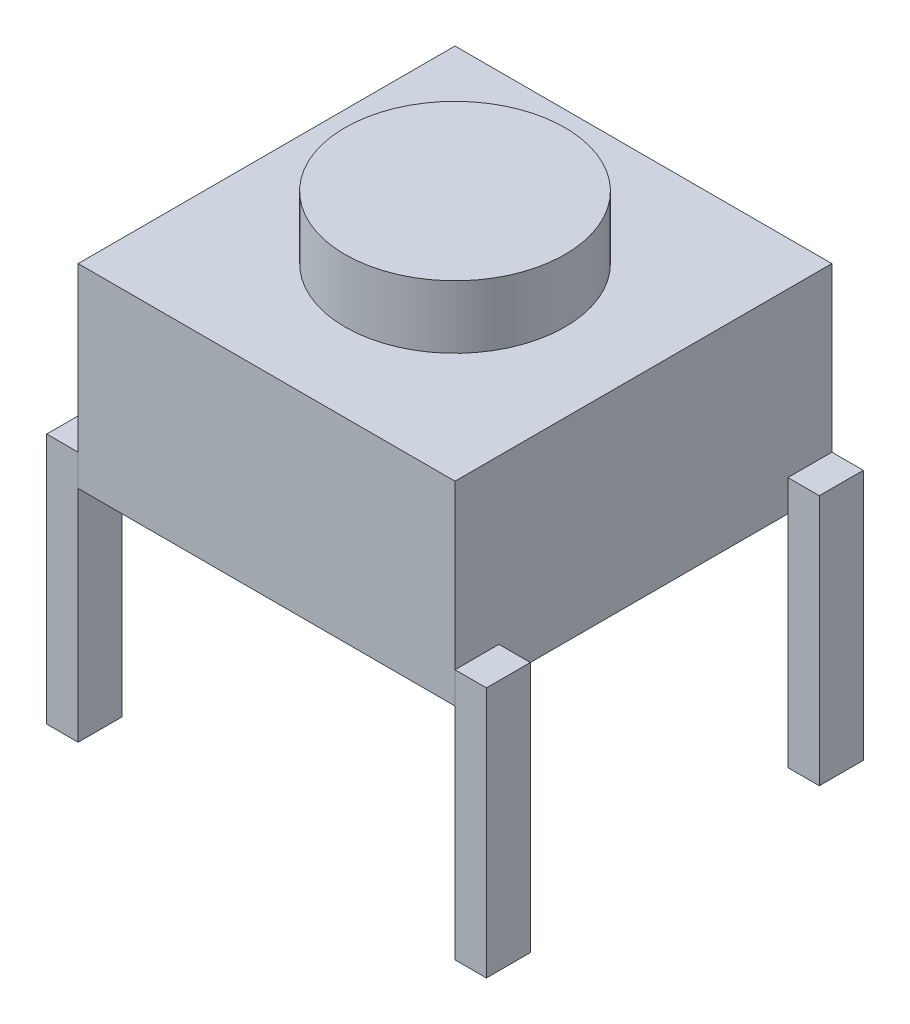
ISO-10303-21;
HEADER;
FILE_DESCRIPTION(('STEP AP214'),'2;1');
FILE_NAME('part.step','',(''),(''),'','','');
FILE_SCHEMA(('AUTOMOTIVE_DESIGN { 1 0 10303 214 1 1 1 1 }'));
ENDSEC;
DATA;
#1=APPLICATION_CONTEXT('core data for automotive mechanical design processes');
#2=APPLICATION_PROTOCOL_DEFINITION('international standard','automotive_design',2000,#1);
#3=PRODUCT_CONTEXT('',#1,'mechanical');
#4=PRODUCT('Part','Part','',(#3));
#5=PRODUCT_RELATED_PRODUCT_CATEGORY('part','',(#4));
#6=PRODUCT_DEFINITION_FORMATION('','',#4);
#7=PRODUCT_DEFINITION_CONTEXT('part definition',#1,'design');
#8=PRODUCT_DEFINITION('design','',#6,#7);
#9=PRODUCT_DEFINITION_SHAPE('','',#8);
#10=(LENGTH_UNIT() NAMED_UNIT(*) SI_UNIT(.MILLI.,.METRE.));
#11=(NAMED_UNIT(*) PLANE_ANGLE_UNIT() SI_UNIT($,.RADIAN.));
#12=(NAMED_UNIT(*) SI_UNIT($,.STERADIAN.) SOLID_ANGLE_UNIT());
#13=UNCERTAINTY_MEASURE_WITH_UNIT(LENGTH_MEASURE(1.E-05),#10,'distance_accuracy_value','');
#14=(GEOMETRIC_REPRESENTATION_CONTEXT(3) GLOBAL_UNCERTAINTY_ASSIGNED_CONTEXT((#13)) GLOBAL_UNIT_ASSIGNED_CONTEXT((#10,
#11,#12)) REPRESENTATION_CONTEXT('',''));
#15=CARTESIAN_POINT('',(0.,0.,0.));
#16=DIRECTION('',(0.,0.,1.));
#17=DIRECTION('',(1.,0.,0.));
#18=AXIS2_PLACEMENT_3D('',#15,#16,#17);
#19=CARTESIAN_POINT('',(-3.,0.5,-2.3));
#20=DIRECTION('',(1.,0.,0.));
#21=DIRECTION('',(0.,0.,-1.));
#22=AXIS2_PLACEMENT_3D('',#19,#20,#21);
#23=PLANE('',#22);
#24=DIRECTION('',(0.,-1.,0.));
#25=VECTOR('',#24,1.);
#26=CARTESIAN_POINT('',(-3.,0.5,-3.));
#27=LINE('',#26,#25);
#28=CARTESIAN_POINT('',(-3.,0.5,-3.));
#29=VERTEX_POINT('',#28);
#30=CARTESIAN_POINT('',(-3.,-3.5,-3.));
#31=VERTEX_POINT('',#30);
#32=EDGE_CURVE('E116',#29,#31,#27,.T.);
#33=ORIENTED_EDGE('',*,*,#32,.F.);
#34=DIRECTION('',(0.,0.,-1.));
#35=VECTOR('',#34,1.);
#36=CARTESIAN_POINT('',(-3.,0.5,-2.3));
#37=LINE('',#36,#35);
#38=CARTESIAN_POINT('',(-3.,0.5,-2.3));
#39=VERTEX_POINT('',#38);
#40=EDGE_CURVE('E12',#39,#29,#37,.T.);
#41=ORIENTED_EDGE('',*,*,#40,.F.);
#42=DIRECTION('',(0.,-1.,0.));
#43=VECTOR('',#42,1.);
#44=CARTESIAN_POINT('',(-3.,0.5,-2.3));
#45=LINE('',#44,#43);
#46=CARTESIAN_POINT('',(-3.,-3.5,-2.3));
#47=VERTEX_POINT('',#46);
#48=EDGE_CURVE('E110',#39,#47,#45,.T.);
#49=ORIENTED_EDGE('',*,*,#48,.T.);
#50=DIRECTION('',(0.,0.,-1.));
#51=VECTOR('',#50,1.);
#52=CARTESIAN_POINT('',(-3.,-3.5,-2.3));
#53=LINE('',#52,#51);
#54=EDGE_CURVE('E55',#47,#31,#53,.T.);
#55=ORIENTED_EDGE('',*,*,#54,.T.);
#56=EDGE_LOOP('',(#33,#41,#49,#55));
#57=FACE_BOUND('',#56,.T.);
#58=ADVANCED_FACE('F52',(#57),#23,.T.);
#59=CARTESIAN_POINT('',(-3.,0.5,-2.3));
#60=DIRECTION('',(0.,1.,0.));
#61=DIRECTION('',(0.,0.,1.));
#62=AXIS2_PLACEMENT_3D('',#59,#60,#61);
#63=PLANE('',#62);
#64=DIRECTION('',(1.,0.,0.));
#65=VECTOR('',#64,1.);
#66=CARTESIAN_POINT('',(-3.,0.5,-3.));
#67=LINE('',#66,#65);
#68=CARTESIAN_POINT('',(-3.5,0.5,-3.));
#69=VERTEX_POINT('',#68);
#70=EDGE_CURVE('E112',#69,#29,#67,.T.);
#71=ORIENTED_EDGE('',*,*,#70,.F.);
#72=DIRECTION('',(0.,0.,-1.));
#73=VECTOR('',#72,1.);
#74=CARTESIAN_POINT('',(-3.5,0.5,-2.3));
#75=LINE('',#74,#73);
#76=CARTESIAN_POINT('',(-3.5,0.5,-2.3));
#77=VERTEX_POINT('',#76);
#78=EDGE_CURVE('E61',#77,#69,#75,.T.);
#79=ORIENTED_EDGE('',*,*,#78,.F.);
#80=DIRECTION('',(1.,0.,0.));
#81=VECTOR('',#80,1.);
#82=CARTESIAN_POINT('',(-3.,0.5,-2.3));
#83=LINE('',#82,#81);
#84=EDGE_CURVE('E107',#77,#39,#83,.T.);
#85=ORIENTED_EDGE('',*,*,#84,.T.);
#86=ORIENTED_EDGE('',*,*,#40,.T.);
#87=EDGE_LOOP('',(#71,#79,#85,#86));
#88=FACE_BOUND('',#87,.T.);
#89=ADVANCED_FACE('F126',(#88),#63,.T.);
#90=CARTESIAN_POINT('',(-3.5,0.5,-2.3));
#91=DIRECTION('',(-1.,0.,0.));
#92=DIRECTION('',(0.,0.,1.));
#93=AXIS2_PLACEMENT_3D('',#90,#91,#92);
#94=PLANE('',#93);
#95=DIRECTION('',(0.,1.,0.));
#96=VECTOR('',#95,1.);
#97=CARTESIAN_POINT('',(-3.5,0.5,-3.));
#98=LINE('',#97,#96);
#99=CARTESIAN_POINT('',(-3.5,-3.5,-3.));
#100=VERTEX_POINT('',#99);
#101=EDGE_CURVE('E102',#100,#69,#98,.T.);
#102=ORIENTED_EDGE('',*,*,#101,.F.);
#103=DIRECTION('',(0.,0.,-1.));
#104=VECTOR('',#103,1.);
#105=CARTESIAN_POINT('',(-3.5,-3.5,-2.3));
#106=LINE('',#105,#104);
#107=CARTESIAN_POINT('',(-3.5,-3.5,-2.3));
#108=VERTEX_POINT('',#107);
#109=EDGE_CURVE('E97',#108,#100,#106,.T.);
#110=ORIENTED_EDGE('',*,*,#109,.F.);
#111=DIRECTION('',(0.,1.,0.));
#112=VECTOR('',#111,1.);
#113=CARTESIAN_POINT('',(-3.5,0.5,-2.3));
#114=LINE('',#113,#112);
#115=EDGE_CURVE('E100',#108,#77,#114,.T.);
#116=ORIENTED_EDGE('',*,*,#115,.T.);
#117=ORIENTED_EDGE('',*,*,#78,.T.);
#118=EDGE_LOOP('',(#102,#110,#116,#117));
#119=FACE_BOUND('',#118,.T.);
#120=ADVANCED_FACE('F99',(#119),#94,.T.);
#121=CARTESIAN_POINT('',(-3.,-3.5,-2.3));
#122=DIRECTION('',(0.,-1.,0.));
#123=DIRECTION('',(0.,0.,-1.));
#124=AXIS2_PLACEMENT_3D('',#121,#122,#123);
#125=PLANE('',#124);
#126=DIRECTION('',(-1.,0.,0.));
#127=VECTOR('',#126,1.);
#128=CARTESIAN_POINT('',(-3.,-3.5,-3.));
#129=LINE('',#128,#127);
#130=EDGE_CURVE('E119',#31,#100,#129,.T.);
#131=ORIENTED_EDGE('',*,*,#130,.F.);
#132=ORIENTED_EDGE('',*,*,#54,.F.);
#133=DIRECTION('',(-1.,0.,0.));
#134=VECTOR('',#133,1.);
#135=CARTESIAN_POINT('',(-3.,-3.5,-2.3));
#136=LINE('',#135,#134);
#137=EDGE_CURVE('E106',#47,#108,#136,.T.);
#138=ORIENTED_EDGE('',*,*,#137,.T.);
#139=ORIENTED_EDGE('',*,*,#109,.T.);
#140=EDGE_LOOP('',(#131,#132,#138,#139));
#141=FACE_BOUND('',#140,.T.);
#142=ADVANCED_FACE('F109',(#141),#125,.T.);
#143=CARTESIAN_POINT('',(0.,0.,-2.3));
#144=DIRECTION('',(0.,0.,-1.));
#145=DIRECTION('',(-1.,0.,0.));
#146=AXIS2_PLACEMENT_3D('',#143,#144,#145);
#147=PLANE('',#146);
#148=ORIENTED_EDGE('',*,*,#48,.F.);
#149=ORIENTED_EDGE('',*,*,#84,.F.);
#150=ORIENTED_EDGE('',*,*,#115,.F.);
#151=ORIENTED_EDGE('',*,*,#137,.F.);
#152=EDGE_LOOP('',(#148,#149,#150,#151));
#153=FACE_BOUND('',#152,.T.);
#154=ADVANCED_FACE('F105',(#153),#147,.F.);
#155=CARTESIAN_POINT('',(0.,0.,-3.));
#156=DIRECTION('',(0.,0.,-1.));
#157=DIRECTION('',(-1.,0.,0.));
#158=AXIS2_PLACEMENT_3D('',#155,#156,#157);
#159=PLANE('',#158);
#160=ORIENTED_EDGE('',*,*,#32,.T.);
#161=ORIENTED_EDGE('',*,*,#130,.T.);
#162=ORIENTED_EDGE('',*,*,#101,.T.);
#163=ORIENTED_EDGE('',*,*,#70,.T.);
#164=EDGE_LOOP('',(#160,#161,#162,#163));
#165=FACE_BOUND('',#164,.T.);
#166=ADVANCED_FACE('F125',(#165),#159,.T.);
#167=CLOSED_SHELL('',(#58,#89,#120,#142,#154,#166));
#168=MANIFOLD_SOLID_BREP('B2',#167);
#169=CARTESIAN_POINT('',(3.,0.5,-2.3));
#170=DIRECTION('',(-1.,0.,0.));
#171=DIRECTION('',(0.,0.,1.));
#172=AXIS2_PLACEMENT_3D('',#169,#170,#171);
#173=PLANE('',#172);
#174=DIRECTION('',(0.,1.,0.));
#175=VECTOR('',#174,1.);
#176=CARTESIAN_POINT('',(3.,0.5,-3.));
#177=LINE('',#176,#175);
#178=CARTESIAN_POINT('',(3.,-3.5,-3.));
#179=VERTEX_POINT('',#178);
#180=CARTESIAN_POINT('',(3.,0.5,-3.));
#181=VERTEX_POINT('',#180);
#182=EDGE_CURVE('E250',#179,#181,#177,.T.);
#183=ORIENTED_EDGE('',*,*,#182,.F.);
#184=DIRECTION('',(0.,0.,-1.));
#185=VECTOR('',#184,1.);
#186=CARTESIAN_POINT('',(3.,-3.5,-2.3));
#187=LINE('',#186,#185);
#188=CARTESIAN_POINT('',(3.,-3.5,-2.3));
#189=VERTEX_POINT('',#188);
#190=EDGE_CURVE('E50',#189,#179,#187,.T.);
#191=ORIENTED_EDGE('',*,*,#190,.F.);
#192=DIRECTION('',(0.,1.,0.));
#193=VECTOR('',#192,1.);
#194=CARTESIAN_POINT('',(3.,0.5,-2.3));
#195=LINE('',#194,#193);
#196=CARTESIAN_POINT('',(3.,0.5,-2.3));
#197=VERTEX_POINT('',#196);
#198=EDGE_CURVE('E244',#189,#197,#195,.T.);
#199=ORIENTED_EDGE('',*,*,#198,.T.);
#200=DIRECTION('',(0.,0.,-1.));
#201=VECTOR('',#200,1.);
#202=CARTESIAN_POINT('',(3.,0.5,-2.3));
#203=LINE('',#202,#201);
#204=EDGE_CURVE('E189',#197,#181,#203,.T.);
#205=ORIENTED_EDGE('',*,*,#204,.T.);
#206=EDGE_LOOP('',(#183,#191,#199,#205));
#207=FACE_BOUND('',#206,.T.);
#208=ADVANCED_FACE('F186',(#207),#173,.T.);
#209=CARTESIAN_POINT('',(3.,-3.5,-2.3));
#210=DIRECTION('',(0.,-1.,0.));
#211=DIRECTION('',(0.,0.,-1.));
#212=AXIS2_PLACEMENT_3D('',#209,#210,#211);
#213=PLANE('',#212);
#214=DIRECTION('',(-1.,0.,0.));
#215=VECTOR('',#214,1.);
#216=CARTESIAN_POINT('',(3.,-3.5,-3.));
#217=LINE('',#216,#215);
#218=CARTESIAN_POINT('',(3.5,-3.5,-3.));
#219=VERTEX_POINT('',#218);
#220=EDGE_CURVE('E246',#219,#179,#217,.T.);
#221=ORIENTED_EDGE('',*,*,#220,.F.);
#222=DIRECTION('',(0.,0.,-1.));
#223=VECTOR('',#222,1.);
#224=CARTESIAN_POINT('',(3.5,-3.5,-2.3));
#225=LINE('',#224,#223);
#226=CARTESIAN_POINT('',(3.5,-3.5,-2.3));
#227=VERTEX_POINT('',#226);
#228=EDGE_CURVE('E195',#227,#219,#225,.T.);
#229=ORIENTED_EDGE('',*,*,#228,.F.);
#230=DIRECTION('',(-1.,0.,0.));
#231=VECTOR('',#230,1.);
#232=CARTESIAN_POINT('',(3.,-3.5,-2.3));
#233=LINE('',#232,#231);
#234=EDGE_CURVE('E241',#227,#189,#233,.T.);
#235=ORIENTED_EDGE('',*,*,#234,.T.);
#236=ORIENTED_EDGE('',*,*,#190,.T.);
#237=EDGE_LOOP('',(#221,#229,#235,#236));
#238=FACE_BOUND('',#237,.T.);
#239=ADVANCED_FACE('F260',(#238),#213,.T.);
#240=CARTESIAN_POINT('',(3.5,0.5,-2.3));
#241=DIRECTION('',(1.,0.,0.));
#242=DIRECTION('',(0.,0.,-1.));
#243=AXIS2_PLACEMENT_3D('',#240,#241,#242);
#244=PLANE('',#243);
#245=DIRECTION('',(0.,-1.,0.));
#246=VECTOR('',#245,1.);
#247=CARTESIAN_POINT('',(3.5,0.5,-3.));
#248=LINE('',#247,#246);
#249=CARTESIAN_POINT('',(3.5,0.5,-3.));
#250=VERTEX_POINT('',#249);
#251=EDGE_CURVE('E236',#250,#219,#248,.T.);
#252=ORIENTED_EDGE('',*,*,#251,.F.);
#253=DIRECTION('',(0.,0.,-1.));
#254=VECTOR('',#253,1.);
#255=CARTESIAN_POINT('',(3.5,0.5,-2.3));
#256=LINE('',#255,#254);
#257=CARTESIAN_POINT('',(3.5,0.5,-2.3));
#258=VERTEX_POINT('',#257);
#259=EDGE_CURVE('E231',#258,#250,#256,.T.);
#260=ORIENTED_EDGE('',*,*,#259,.F.);
#261=DIRECTION('',(0.,-1.,0.));
#262=VECTOR('',#261,1.);
#263=CARTESIAN_POINT('',(3.5,0.5,-2.3));
#264=LINE('',#263,#262);
#265=EDGE_CURVE('E234',#258,#227,#264,.T.);
#266=ORIENTED_EDGE('',*,*,#265,.T.);
#267=ORIENTED_EDGE('',*,*,#228,.T.);
#268=EDGE_LOOP('',(#252,#260,#266,#267));
#269=FACE_BOUND('',#268,.T.);
#270=ADVANCED_FACE('F233',(#269),#244,.T.);
#271=CARTESIAN_POINT('',(3.,0.5,-2.3));
#272=DIRECTION('',(0.,1.,0.));
#273=DIRECTION('',(0.,0.,1.));
#274=AXIS2_PLACEMENT_3D('',#271,#272,#273);
#275=PLANE('',#274);
#276=DIRECTION('',(1.,0.,0.));
#277=VECTOR('',#276,1.);
#278=CARTESIAN_POINT('',(3.,0.5,-3.));
#279=LINE('',#278,#277);
#280=EDGE_CURVE('E253',#181,#250,#279,.T.);
#281=ORIENTED_EDGE('',*,*,#280,.F.);
#282=ORIENTED_EDGE('',*,*,#204,.F.);
#283=DIRECTION('',(1.,0.,0.));
#284=VECTOR('',#283,1.);
#285=CARTESIAN_POINT('',(3.,0.5,-2.3));
#286=LINE('',#285,#284);
#287=EDGE_CURVE('E240',#197,#258,#286,.T.);
#288=ORIENTED_EDGE('',*,*,#287,.T.);
#289=ORIENTED_EDGE('',*,*,#259,.T.);
#290=EDGE_LOOP('',(#281,#282,#288,#289));
#291=FACE_BOUND('',#290,.T.);
#292=ADVANCED_FACE('F243',(#291),#275,.T.);
#293=CARTESIAN_POINT('',(0.,0.,-2.3));
#294=DIRECTION('',(0.,0.,1.));
#295=DIRECTION('',(1.,0.,0.));
#296=AXIS2_PLACEMENT_3D('',#293,#294,#295);
#297=PLANE('',#296);
#298=ORIENTED_EDGE('',*,*,#198,.F.);
#299=ORIENTED_EDGE('',*,*,#234,.F.);
#300=ORIENTED_EDGE('',*,*,#265,.F.);
#301=ORIENTED_EDGE('',*,*,#287,.F.);
#302=EDGE_LOOP('',(#298,#299,#300,#301));
#303=FACE_BOUND('',#302,.T.);
#304=ADVANCED_FACE('F239',(#303),#297,.T.);
#305=CARTESIAN_POINT('',(0.,0.,-3.));
#306=DIRECTION('',(0.,0.,1.));
#307=DIRECTION('',(1.,0.,0.));
#308=AXIS2_PLACEMENT_3D('',#305,#306,#307);
#309=PLANE('',#308);
#310=ORIENTED_EDGE('',*,*,#182,.T.);
#311=ORIENTED_EDGE('',*,*,#280,.T.);
#312=ORIENTED_EDGE('',*,*,#251,.T.);
#313=ORIENTED_EDGE('',*,*,#220,.T.);
#314=EDGE_LOOP('',(#310,#311,#312,#313));
#315=FACE_BOUND('',#314,.T.);
#316=ADVANCED_FACE('F259',(#315),#309,.F.);
#317=CLOSED_SHELL('',(#208,#239,#270,#292,#304,#316));
#318=MANIFOLD_SOLID_BREP('B6',#317);
#319=CARTESIAN_POINT('',(-3.,0.5,2.3));
#320=DIRECTION('',(0.,1.,0.));
#321=DIRECTION('',(0.,0.,1.));
#322=AXIS2_PLACEMENT_3D('',#319,#320,#321);
#323=PLANE('',#322);
#324=DIRECTION('',(-1.,0.,0.));
#325=VECTOR('',#324,1.);
#326=CARTESIAN_POINT('',(-3.,0.5,3.));
#327=LINE('',#326,#325);
#328=CARTESIAN_POINT('',(-3.,0.5,3.));
#329=VERTEX_POINT('',#328);
#330=CARTESIAN_POINT('',(-3.5,0.5,3.));
#331=VERTEX_POINT('',#330);
#332=EDGE_CURVE('E384',#329,#331,#327,.T.);
#333=ORIENTED_EDGE('',*,*,#332,.F.);
#334=DIRECTION('',(0.,0.,1.));
#335=VECTOR('',#334,1.);
#336=CARTESIAN_POINT('',(-3.,0.5,2.3));
#337=LINE('',#336,#335);
#338=CARTESIAN_POINT('',(-3.,0.5,2.3));
#339=VERTEX_POINT('',#338);
#340=EDGE_CURVE('E184',#339,#329,#337,.T.);
#341=ORIENTED_EDGE('',*,*,#340,.F.);
#342=DIRECTION('',(-1.,0.,0.));
#343=VECTOR('',#342,1.);
#344=CARTESIAN_POINT('',(-3.,0.5,2.3));
#345=LINE('',#344,#343);
#346=CARTESIAN_POINT('',(-3.5,0.5,2.3));
#347=VERTEX_POINT('',#346);
#348=EDGE_CURVE('E378',#339,#347,#345,.T.);
#349=ORIENTED_EDGE('',*,*,#348,.T.);
#350=DIRECTION('',(0.,0.,1.));
#351=VECTOR('',#350,1.);
#352=CARTESIAN_POINT('',(-3.5,0.5,2.3));
#353=LINE('',#352,#351);
#354=EDGE_CURVE('E323',#347,#331,#353,.T.);
#355=ORIENTED_EDGE('',*,*,#354,.T.);
#356=EDGE_LOOP('',(#333,#341,#349,#355));
#357=FACE_BOUND('',#356,.T.);
#358=ADVANCED_FACE('F320',(#357),#323,.T.);
#359=CARTESIAN_POINT('',(-3.,0.5,2.3));
#360=DIRECTION('',(1.,0.,0.));
#361=DIRECTION('',(0.,1.,0.));
#362=AXIS2_PLACEMENT_3D('',#359,#360,#361);
#363=PLANE('',#362);
#364=DIRECTION('',(0.,1.,0.));
#365=VECTOR('',#364,1.);
#366=CARTESIAN_POINT('',(-3.,0.5,3.));
#367=LINE('',#366,#365);
#368=CARTESIAN_POINT('',(-3.,-3.5,3.));
#369=VERTEX_POINT('',#368);
#370=EDGE_CURVE('E380',#369,#329,#367,.T.);
#371=ORIENTED_EDGE('',*,*,#370,.F.);
#372=DIRECTION('',(0.,0.,1.));
#373=VECTOR('',#372,1.);
#374=CARTESIAN_POINT('',(-3.,-3.5,2.3));
#375=LINE('',#374,#373);
#376=CARTESIAN_POINT('',(-3.,-3.5,2.3));
#377=VERTEX_POINT('',#376);
#378=EDGE_CURVE('E329',#377,#369,#375,.T.);
#379=ORIENTED_EDGE('',*,*,#378,.F.);
#380=DIRECTION('',(0.,1.,0.));
#381=VECTOR('',#380,1.);
#382=CARTESIAN_POINT('',(-3.,0.5,2.3));
#383=LINE('',#382,#381);
#384=EDGE_CURVE('E375',#377,#339,#383,.T.);
#385=ORIENTED_EDGE('',*,*,#384,.T.);
#386=ORIENTED_EDGE('',*,*,#340,.T.);
#387=EDGE_LOOP('',(#371,#379,#385,#386));
#388=FACE_BOUND('',#387,.T.);
#389=ADVANCED_FACE('F394',(#388),#363,.T.);
#390=CARTESIAN_POINT('',(-3.,-3.5,2.3));
#391=DIRECTION('',(0.,-1.,0.));
#392=DIRECTION('',(0.,0.,-1.));
#393=AXIS2_PLACEMENT_3D('',#390,#391,#392);
#394=PLANE('',#393);
#395=DIRECTION('',(1.,0.,0.));
#396=VECTOR('',#395,1.);
#397=CARTESIAN_POINT('',(-3.,-3.5,3.));
#398=LINE('',#397,#396);
#399=CARTESIAN_POINT('',(-3.5,-3.5,3.));
#400=VERTEX_POINT('',#399);
#401=EDGE_CURVE('E370',#400,#369,#398,.T.);
#402=ORIENTED_EDGE('',*,*,#401,.F.);
#403=DIRECTION('',(0.,0.,1.));
#404=VECTOR('',#403,1.);
#405=CARTESIAN_POINT('',(-3.5,-3.5,2.3));
#406=LINE('',#405,#404);
#407=CARTESIAN_POINT('',(-3.5,-3.5,2.3));
#408=VERTEX_POINT('',#407);
#409=EDGE_CURVE('E365',#408,#400,#406,.T.);
#410=ORIENTED_EDGE('',*,*,#409,.F.);
#411=DIRECTION('',(1.,0.,0.));
#412=VECTOR('',#411,1.);
#413=CARTESIAN_POINT('',(-3.,-3.5,2.3));
#414=LINE('',#413,#412);
#415=EDGE_CURVE('E368',#408,#377,#414,.T.);
#416=ORIENTED_EDGE('',*,*,#415,.T.);
#417=ORIENTED_EDGE('',*,*,#378,.T.);
#418=EDGE_LOOP('',(#402,#410,#416,#417));
#419=FACE_BOUND('',#418,.T.);
#420=ADVANCED_FACE('F367',(#419),#394,.T.);
#421=CARTESIAN_POINT('',(-3.5,0.5,2.3));
#422=DIRECTION('',(-1.,0.,0.));
#423=DIRECTION('',(0.,-1.,0.));
#424=AXIS2_PLACEMENT_3D('',#421,#422,#423);
#425=PLANE('',#424);
#426=DIRECTION('',(0.,-1.,0.));
#427=VECTOR('',#426,1.);
#428=CARTESIAN_POINT('',(-3.5,0.5,3.));
#429=LINE('',#428,#427);
#430=EDGE_CURVE('E387',#331,#400,#429,.T.);
#431=ORIENTED_EDGE('',*,*,#430,.F.);
#432=ORIENTED_EDGE('',*,*,#354,.F.);
#433=DIRECTION('',(0.,-1.,0.));
#434=VECTOR('',#433,1.);
#435=CARTESIAN_POINT('',(-3.5,0.5,2.3));
#436=LINE('',#435,#434);
#437=EDGE_CURVE('E374',#347,#408,#436,.T.);
#438=ORIENTED_EDGE('',*,*,#437,.T.);
#439=ORIENTED_EDGE('',*,*,#409,.T.);
#440=EDGE_LOOP('',(#431,#432,#438,#439));
#441=FACE_BOUND('',#440,.T.);
#442=ADVANCED_FACE('F377',(#441),#425,.T.);
#443=CARTESIAN_POINT('',(0.,0.,2.3));
#444=DIRECTION('',(0.,0.,1.));
#445=DIRECTION('',(1.,0.,0.));
#446=AXIS2_PLACEMENT_3D('',#443,#444,#445);
#447=PLANE('',#446);
#448=ORIENTED_EDGE('',*,*,#348,.F.);
#449=ORIENTED_EDGE('',*,*,#384,.F.);
#450=ORIENTED_EDGE('',*,*,#415,.F.);
#451=ORIENTED_EDGE('',*,*,#437,.F.);
#452=EDGE_LOOP('',(#448,#449,#450,#451));
#453=FACE_BOUND('',#452,.T.);
#454=ADVANCED_FACE('F373',(#453),#447,.F.);
#455=CARTESIAN_POINT('',(0.,0.,3.));
#456=DIRECTION('',(0.,0.,1.));
#457=DIRECTION('',(1.,0.,0.));
#458=AXIS2_PLACEMENT_3D('',#455,#456,#457);
#459=PLANE('',#458);
#460=ORIENTED_EDGE('',*,*,#332,.T.);
#461=ORIENTED_EDGE('',*,*,#430,.T.);
#462=ORIENTED_EDGE('',*,*,#401,.T.);
#463=ORIENTED_EDGE('',*,*,#370,.T.);
#464=EDGE_LOOP('',(#460,#461,#462,#463));
#465=FACE_BOUND('',#464,.T.);
#466=ADVANCED_FACE('F393',(#465),#459,.T.);
#467=CLOSED_SHELL('',(#358,#389,#420,#442,#454,#466));
#468=MANIFOLD_SOLID_BREP('B44',#467);
#469=CARTESIAN_POINT('',(3.,0.5,2.3));
#470=DIRECTION('',(-1.,0.,0.));
#471=DIRECTION('',(0.,-1.,0.));
#472=AXIS2_PLACEMENT_3D('',#469,#470,#471);
#473=PLANE('',#472);
#474=DIRECTION('',(0.,-1.,0.));
#475=VECTOR('',#474,1.);
#476=CARTESIAN_POINT('',(3.,0.5,3.));
#477=LINE('',#476,#475);
#478=CARTESIAN_POINT('',(3.,0.5,3.));
#479=VERTEX_POINT('',#478);
#480=CARTESIAN_POINT('',(3.,-3.5,3.));
#481=VERTEX_POINT('',#480);
#482=EDGE_CURVE('E517',#479,#481,#477,.T.);
#483=ORIENTED_EDGE('',*,*,#482,.F.);
#484=DIRECTION('',(0.,0.,1.));
#485=VECTOR('',#484,1.);
#486=CARTESIAN_POINT('',(3.,0.5,2.3));
#487=LINE('',#486,#485);
#488=CARTESIAN_POINT('',(3.,0.5,2.3));
#489=VERTEX_POINT('',#488);
#490=EDGE_CURVE('E318',#489,#479,#487,.T.);
#491=ORIENTED_EDGE('',*,*,#490,.F.);
#492=DIRECTION('',(0.,-1.,0.));
#493=VECTOR('',#492,1.);
#494=CARTESIAN_POINT('',(3.,0.5,2.3));
#495=LINE('',#494,#493);
#496=CARTESIAN_POINT('',(3.,-3.5,2.3));
#497=VERTEX_POINT('',#496);
#498=EDGE_CURVE('E511',#489,#497,#495,.T.);
#499=ORIENTED_EDGE('',*,*,#498,.T.);
#500=DIRECTION('',(0.,0.,1.));
#501=VECTOR('',#500,1.);
#502=CARTESIAN_POINT('',(3.,-3.5,2.3));
#503=LINE('',#502,#501);
#504=EDGE_CURVE('E456',#497,#481,#503,.T.);
#505=ORIENTED_EDGE('',*,*,#504,.T.);
#506=EDGE_LOOP('',(#483,#491,#499,#505));
#507=FACE_BOUND('',#506,.T.);
#508=ADVANCED_FACE('F453',(#507),#473,.T.);
#509=CARTESIAN_POINT('',(3.,0.5,2.3));
#510=DIRECTION('',(0.,1.,0.));
#511=DIRECTION('',(0.,0.,1.));
#512=AXIS2_PLACEMENT_3D('',#509,#510,#511);
#513=PLANE('',#512);
#514=DIRECTION('',(-1.,0.,0.));
#515=VECTOR('',#514,1.);
#516=CARTESIAN_POINT('',(3.,0.5,3.));
#517=LINE('',#516,#515);
#518=CARTESIAN_POINT('',(3.5,0.5,3.));
#519=VERTEX_POINT('',#518);
#520=EDGE_CURVE('E513',#519,#479,#517,.T.);
#521=ORIENTED_EDGE('',*,*,#520,.F.);
#522=DIRECTION('',(0.,0.,1.));
#523=VECTOR('',#522,1.);
#524=CARTESIAN_POINT('',(3.5,0.5,2.3));
#525=LINE('',#524,#523);
#526=CARTESIAN_POINT('',(3.5,0.5,2.3));
#527=VERTEX_POINT('',#526);
#528=EDGE_CURVE('E462',#527,#519,#525,.T.);
#529=ORIENTED_EDGE('',*,*,#528,.F.);
#530=DIRECTION('',(-1.,0.,0.));
#531=VECTOR('',#530,1.);
#532=CARTESIAN_POINT('',(3.,0.5,2.3));
#533=LINE('',#532,#531);
#534=EDGE_CURVE('E508',#527,#489,#533,.T.);
#535=ORIENTED_EDGE('',*,*,#534,.T.);
#536=ORIENTED_EDGE('',*,*,#490,.T.);
#537=EDGE_LOOP('',(#521,#529,#535,#536));
#538=FACE_BOUND('',#537,.T.);
#539=ADVANCED_FACE('F527',(#538),#513,.T.);
#540=CARTESIAN_POINT('',(3.5,0.5,2.3));
#541=DIRECTION('',(1.,0.,0.));
#542=DIRECTION('',(0.,1.,0.));
#543=AXIS2_PLACEMENT_3D('',#540,#541,#542);
#544=PLANE('',#543);
#545=DIRECTION('',(0.,1.,0.));
#546=VECTOR('',#545,1.);
#547=CARTESIAN_POINT('',(3.5,0.5,3.));
#548=LINE('',#547,#546);
#549=CARTESIAN_POINT('',(3.5,-3.5,3.));
#550=VERTEX_POINT('',#549);
#551=EDGE_CURVE('E503',#550,#519,#548,.T.);
#552=ORIENTED_EDGE('',*,*,#551,.F.);
#553=DIRECTION('',(0.,0.,1.));
#554=VECTOR('',#553,1.);
#555=CARTESIAN_POINT('',(3.5,-3.5,2.3));
#556=LINE('',#555,#554);
#557=CARTESIAN_POINT('',(3.5,-3.5,2.3));
#558=VERTEX_POINT('',#557);
#559=EDGE_CURVE('E498',#558,#550,#556,.T.);
#560=ORIENTED_EDGE('',*,*,#559,.F.);
#561=DIRECTION('',(0.,1.,0.));
#562=VECTOR('',#561,1.);
#563=CARTESIAN_POINT('',(3.5,0.5,2.3));
#564=LINE('',#563,#562);
#565=EDGE_CURVE('E501',#558,#527,#564,.T.);
#566=ORIENTED_EDGE('',*,*,#565,.T.);
#567=ORIENTED_EDGE('',*,*,#528,.T.);
#568=EDGE_LOOP('',(#552,#560,#566,#567));
#569=FACE_BOUND('',#568,.T.);
#570=ADVANCED_FACE('F500',(#569),#544,.T.);
#571=CARTESIAN_POINT('',(3.,-3.5,2.3));
#572=DIRECTION('',(0.,-1.,0.));
#573=DIRECTION('',(0.,0.,-1.));
#574=AXIS2_PLACEMENT_3D('',#571,#572,#573);
#575=PLANE('',#574);
#576=DIRECTION('',(1.,0.,0.));
#577=VECTOR('',#576,1.);
#578=CARTESIAN_POINT('',(3.,-3.5,3.));
#579=LINE('',#578,#577);
#580=EDGE_CURVE('E520',#481,#550,#579,.T.);
#581=ORIENTED_EDGE('',*,*,#580,.F.);
#582=ORIENTED_EDGE('',*,*,#504,.F.);
#583=DIRECTION('',(1.,0.,0.));
#584=VECTOR('',#583,1.);
#585=CARTESIAN_POINT('',(3.,-3.5,2.3));
#586=LINE('',#585,#584);
#587=EDGE_CURVE('E507',#497,#558,#586,.T.);
#588=ORIENTED_EDGE('',*,*,#587,.T.);
#589=ORIENTED_EDGE('',*,*,#559,.T.);
#590=EDGE_LOOP('',(#581,#582,#588,#589));
#591=FACE_BOUND('',#590,.T.);
#592=ADVANCED_FACE('F510',(#591),#575,.T.);
#593=CARTESIAN_POINT('',(0.,0.,2.3));
#594=DIRECTION('',(0.,0.,1.));
#595=DIRECTION('',(1.,0.,0.));
#596=AXIS2_PLACEMENT_3D('',#593,#594,#595);
#597=PLANE('',#596);
#598=ORIENTED_EDGE('',*,*,#498,.F.);
#599=ORIENTED_EDGE('',*,*,#534,.F.);
#600=ORIENTED_EDGE('',*,*,#565,.F.);
#601=ORIENTED_EDGE('',*,*,#587,.F.);
#602=EDGE_LOOP('',(#598,#599,#600,#601));
#603=FACE_BOUND('',#602,.T.);
#604=ADVANCED_FACE('F506',(#603),#597,.F.);
#605=CARTESIAN_POINT('',(0.,0.,3.));
#606=DIRECTION('',(0.,0.,1.));
#607=DIRECTION('',(1.,0.,0.));
#608=AXIS2_PLACEMENT_3D('',#605,#606,#607);
#609=PLANE('',#608);
#610=ORIENTED_EDGE('',*,*,#482,.T.);
#611=ORIENTED_EDGE('',*,*,#580,.T.);
#612=ORIENTED_EDGE('',*,*,#551,.T.);
#613=ORIENTED_EDGE('',*,*,#520,.T.);
#614=EDGE_LOOP('',(#610,#611,#612,#613));
#615=FACE_BOUND('',#614,.T.);
#616=ADVANCED_FACE('F526',(#615),#609,.T.);
#617=CLOSED_SHELL('',(#508,#539,#570,#592,#604,#616));
#618=MANIFOLD_SOLID_BREP('B178',#617);
#619=CARTESIAN_POINT('',(-3.,3.1,-3.));
#620=DIRECTION('',(1.,0.,0.));
#621=DIRECTION('',(0.,0.,-1.));
#622=AXIS2_PLACEMENT_3D('',#619,#620,#621);
#623=PLANE('',#622);
#624=DIRECTION('',(0.,0.,1.));
#625=VECTOR('',#624,1.);
#626=CARTESIAN_POINT('',(-3.,0.,-3.));
#627=LINE('',#626,#625);
#628=CARTESIAN_POINT('',(-3.,0.,-3.));
#629=VERTEX_POINT('',#628);
#630=CARTESIAN_POINT('',(-3.,0.,3.));
#631=VERTEX_POINT('',#630);
#632=EDGE_CURVE('E648',#629,#631,#627,.T.);
#633=ORIENTED_EDGE('',*,*,#632,.T.);
#634=DIRECTION('',(0.,-1.,0.));
#635=VECTOR('',#634,1.);
#636=CARTESIAN_POINT('',(-3.,3.1,3.));
#637=LINE('',#636,#635);
#638=CARTESIAN_POINT('',(-3.,3.1,3.));
#639=VERTEX_POINT('',#638);
#640=EDGE_CURVE('E580',#639,#631,#637,.T.);
#641=ORIENTED_EDGE('',*,*,#640,.F.);
#642=DIRECTION('',(0.,0.,1.));
#643=VECTOR('',#642,1.);
#644=CARTESIAN_POINT('',(-3.,3.1,-3.));
#645=LINE('',#644,#643);
#646=CARTESIAN_POINT('',(-3.,3.1,-3.));
#647=VERTEX_POINT('',#646);
#648=EDGE_CURVE('E631',#647,#639,#645,.T.);
#649=ORIENTED_EDGE('',*,*,#648,.F.);
#650=DIRECTION('',(0.,-1.,0.));
#651=VECTOR('',#650,1.);
#652=CARTESIAN_POINT('',(-3.,3.1,-3.));
#653=LINE('',#652,#651);
#654=EDGE_CURVE('E644',#647,#629,#653,.T.);
#655=ORIENTED_EDGE('',*,*,#654,.T.);
#656=EDGE_LOOP('',(#633,#641,#649,#655));
#657=FACE_BOUND('',#656,.T.);
#658=ADVANCED_FACE('F577',(#657),#623,.F.);
#659=CARTESIAN_POINT('',(-3.,3.1,3.));
#660=DIRECTION('',(0.,0.,-1.));
#661=DIRECTION('',(-1.,0.,0.));
#662=AXIS2_PLACEMENT_3D('',#659,#660,#661);
#663=PLANE('',#662);
#664=DIRECTION('',(1.,0.,0.));
#665=VECTOR('',#664,1.);
#666=CARTESIAN_POINT('',(-3.,0.,3.));
#667=LINE('',#666,#665);
#668=CARTESIAN_POINT('',(3.,0.,3.));
#669=VERTEX_POINT('',#668);
#670=EDGE_CURVE('E637',#631,#669,#667,.T.);
#671=ORIENTED_EDGE('',*,*,#670,.T.);
#672=DIRECTION('',(0.,-1.,0.));
#673=VECTOR('',#672,1.);
#674=CARTESIAN_POINT('',(3.,3.1,3.));
#675=LINE('',#674,#673);
#676=CARTESIAN_POINT('',(3.,3.1,3.));
#677=VERTEX_POINT('',#676);
#678=EDGE_CURVE('E635',#677,#669,#675,.T.);
#679=ORIENTED_EDGE('',*,*,#678,.F.);
#680=DIRECTION('',(1.,0.,0.));
#681=VECTOR('',#680,1.);
#682=CARTESIAN_POINT('',(-3.,3.1,3.));
#683=LINE('',#682,#681);
#684=EDGE_CURVE('E626',#639,#677,#683,.T.);
#685=ORIENTED_EDGE('',*,*,#684,.F.);
#686=ORIENTED_EDGE('',*,*,#640,.T.);
#687=EDGE_LOOP('',(#671,#679,#685,#686));
#688=FACE_BOUND('',#687,.T.);
#689=ADVANCED_FACE('F636',(#688),#663,.F.);
#690=CARTESIAN_POINT('',(3.,3.1,-3.));
#691=DIRECTION('',(-1.,0.,0.));
#692=DIRECTION('',(0.,0.,1.));
#693=AXIS2_PLACEMENT_3D('',#690,#691,#692);
#694=PLANE('',#693);
#695=DIRECTION('',(0.,0.,-1.));
#696=VECTOR('',#695,1.);
#697=CARTESIAN_POINT('',(3.,0.,-3.));
#698=LINE('',#697,#696);
#699=CARTESIAN_POINT('',(3.,0.,-3.));
#700=VERTEX_POINT('',#699);
#701=EDGE_CURVE('E612',#669,#700,#698,.T.);
#702=ORIENTED_EDGE('',*,*,#701,.T.);
#703=DIRECTION('',(0.,-1.,0.));
#704=VECTOR('',#703,1.);
#705=CARTESIAN_POINT('',(3.,3.1,-3.));
#706=LINE('',#705,#704);
#707=CARTESIAN_POINT('',(3.,3.1,-3.));
#708=VERTEX_POINT('',#707);
#709=EDGE_CURVE('E639',#708,#700,#706,.T.);
#710=ORIENTED_EDGE('',*,*,#709,.F.);
#711=DIRECTION('',(0.,0.,-1.));
#712=VECTOR('',#711,1.);
#713=CARTESIAN_POINT('',(3.,3.1,-3.));
#714=LINE('',#713,#712);
#715=EDGE_CURVE('E629',#677,#708,#714,.T.);
#716=ORIENTED_EDGE('',*,*,#715,.F.);
#717=ORIENTED_EDGE('',*,*,#678,.T.);
#718=EDGE_LOOP('',(#702,#710,#716,#717));
#719=FACE_BOUND('',#718,.T.);
#720=ADVANCED_FACE('F640',(#719),#694,.F.);
#721=CARTESIAN_POINT('',(-3.,3.1,-3.));
#722=DIRECTION('',(0.,0.,1.));
#723=DIRECTION('',(1.,0.,0.));
#724=AXIS2_PLACEMENT_3D('',#721,#722,#723);
#725=PLANE('',#724);
#726=DIRECTION('',(-1.,0.,0.));
#727=VECTOR('',#726,1.);
#728=CARTESIAN_POINT('',(-3.,0.,-3.));
#729=LINE('',#728,#727);
#730=EDGE_CURVE('E618',#700,#629,#729,.T.);
#731=ORIENTED_EDGE('',*,*,#730,.T.);
#732=ORIENTED_EDGE('',*,*,#654,.F.);
#733=DIRECTION('',(-1.,0.,0.));
#734=VECTOR('',#733,1.);
#735=CARTESIAN_POINT('',(-3.,3.1,-3.));
#736=LINE('',#735,#734);
#737=EDGE_CURVE('E595',#708,#647,#736,.T.);
#738=ORIENTED_EDGE('',*,*,#737,.F.);
#739=ORIENTED_EDGE('',*,*,#709,.T.);
#740=EDGE_LOOP('',(#731,#732,#738,#739));
#741=FACE_BOUND('',#740,.T.);
#742=ADVANCED_FACE('F662',(#741),#725,.F.);
#743=CARTESIAN_POINT('',(0.,3.1,0.));
#744=DIRECTION('',(0.,1.,0.));
#745=DIRECTION('',(0.,0.,1.));
#746=AXIS2_PLACEMENT_3D('',#743,#744,#745);
#747=PLANE('',#746);
#748=CARTESIAN_POINT('',(0.,3.1,0.));
#749=DIRECTION('',(0.,1.,0.));
#750=DIRECTION('',(0.,0.,1.));
#751=AXIS2_PLACEMENT_3D('',#748,#749,#750);
#752=CIRCLE('',#751,1.75);
#753=CARTESIAN_POINT('',(0.,3.1,1.75));
#754=VERTEX_POINT('',#753);
#755=EDGE_CURVE('E451',#754,#754,#752,.T.);
#756=ORIENTED_EDGE('',*,*,#755,.F.);
#757=EDGE_LOOP('',(#756));
#758=FACE_BOUND('',#757,.T.);
#759=ORIENTED_EDGE('',*,*,#648,.T.);
#760=ORIENTED_EDGE('',*,*,#684,.T.);
#761=ORIENTED_EDGE('',*,*,#715,.T.);
#762=ORIENTED_EDGE('',*,*,#737,.T.);
#763=EDGE_LOOP('',(#759,#760,#761,#762));
#764=FACE_BOUND('',#763,.T.);
#765=ADVANCED_FACE('F627',(#758,#764),#747,.T.);
#766=CARTESIAN_POINT('',(0.,0.,0.));
#767=DIRECTION('',(0.,1.,0.));
#768=DIRECTION('',(0.,0.,1.));
#769=AXIS2_PLACEMENT_3D('',#766,#767,#768);
#770=PLANE('',#769);
#771=ORIENTED_EDGE('',*,*,#632,.F.);
#772=ORIENTED_EDGE('',*,*,#730,.F.);
#773=ORIENTED_EDGE('',*,*,#701,.F.);
#774=ORIENTED_EDGE('',*,*,#670,.F.);
#775=EDGE_LOOP('',(#771,#772,#773,#774));
#776=FACE_BOUND('',#775,.T.);
#777=ADVANCED_FACE('F665',(#776),#770,.F.);
#778=CARTESIAN_POINT('',(0.,4.1,0.));
#779=DIRECTION('',(0.,-1.,0.));
#780=DIRECTION('',(0.,0.,-1.));
#781=AXIS2_PLACEMENT_3D('',#778,#779,#780);
#782=CYLINDRICAL_SURFACE('',#781,1.75);
#783=CARTESIAN_POINT('',(0.,4.1,0.));
#784=DIRECTION('',(0.,1.,0.));
#785=DIRECTION('',(0.,0.,1.));
#786=AXIS2_PLACEMENT_3D('',#783,#784,#785);
#787=CIRCLE('',#786,1.75);
#788=CARTESIAN_POINT('',(0.,4.1,1.75));
#789=VERTEX_POINT('',#788);
#790=EDGE_CURVE('E652',#789,#789,#787,.T.);
#791=ORIENTED_EDGE('',*,*,#790,.F.);
#792=EDGE_LOOP('',(#791));
#793=FACE_BOUND('',#792,.T.);
#794=ORIENTED_EDGE('',*,*,#755,.T.);
#795=EDGE_LOOP('',(#794));
#796=FACE_BOUND('',#795,.T.);
#797=ADVANCED_FACE('F675',(#793,#796),#782,.T.);
#798=CARTESIAN_POINT('',(0.,4.1,0.));
#799=DIRECTION('',(0.,1.,0.));
#800=DIRECTION('',(0.,0.,1.));
#801=AXIS2_PLACEMENT_3D('',#798,#799,#800);
#802=PLANE('',#801);
#803=ORIENTED_EDGE('',*,*,#790,.T.);
#804=EDGE_LOOP('',(#803));
#805=FACE_BOUND('',#804,.T.);
#806=ADVANCED_FACE('F673',(#805),#802,.T.);
#807=CLOSED_SHELL('',(#658,#689,#720,#742,#765,#777,#797,#806));
#808=MANIFOLD_SOLID_BREP('B312',#807);
#809=ADVANCED_BREP_SHAPE_REPRESENTATION('',(#18,#168,#318,#468,#618,#808),#14);
#810=SHAPE_DEFINITION_REPRESENTATION(#9,#809);
ENDSEC;
END-ISO-10303-21;
